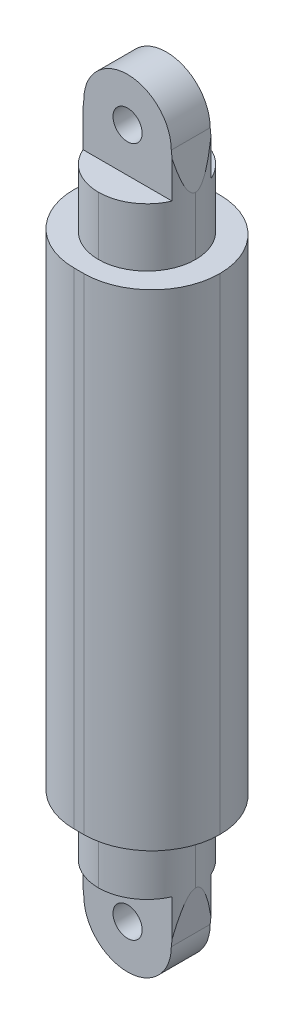
ISO-10303-21;
HEADER;
FILE_DESCRIPTION(('STEP AP214'),'2;1');
FILE_NAME('part.step','',(''),(''),'','','');
FILE_SCHEMA(('AUTOMOTIVE_DESIGN { 1 0 10303 214 1 1 1 1 }'));
ENDSEC;
DATA;
#1=APPLICATION_CONTEXT('core data for automotive mechanical design processes');
#2=APPLICATION_PROTOCOL_DEFINITION('international standard','automotive_design',2000,#1);
#3=PRODUCT_CONTEXT('',#1,'mechanical');
#4=PRODUCT('Part','Part','',(#3));
#5=PRODUCT_RELATED_PRODUCT_CATEGORY('part','',(#4));
#6=PRODUCT_DEFINITION_FORMATION('','',#4);
#7=PRODUCT_DEFINITION_CONTEXT('part definition',#1,'design');
#8=PRODUCT_DEFINITION('design','',#6,#7);
#9=PRODUCT_DEFINITION_SHAPE('','',#8);
#10=(LENGTH_UNIT() NAMED_UNIT(*) SI_UNIT(.MILLI.,.METRE.));
#11=(NAMED_UNIT(*) PLANE_ANGLE_UNIT() SI_UNIT($,.RADIAN.));
#12=(NAMED_UNIT(*) SI_UNIT($,.STERADIAN.) SOLID_ANGLE_UNIT());
#13=UNCERTAINTY_MEASURE_WITH_UNIT(LENGTH_MEASURE(1.E-05),#10,'distance_accuracy_value','');
#14=(GEOMETRIC_REPRESENTATION_CONTEXT(3) GLOBAL_UNCERTAINTY_ASSIGNED_CONTEXT((#13)) GLOBAL_UNIT_ASSIGNED_CONTEXT((#10,
#11,#12)) REPRESENTATION_CONTEXT('',''));
#15=CARTESIAN_POINT('',(0.,0.,0.));
#16=DIRECTION('',(0.,0.,1.));
#17=DIRECTION('',(1.,0.,0.));
#18=AXIS2_PLACEMENT_3D('',#15,#16,#17);
#19=CARTESIAN_POINT('',(0.,0.,5.));
#20=DIRECTION('',(0.,-1.,0.));
#21=DIRECTION('',(0.,0.,-1.));
#22=AXIS2_PLACEMENT_3D('',#19,#20,#21);
#23=CYLINDRICAL_SURFACE('',#22,5.);
#24=CARTESIAN_POINT('',(0.,-25.,5.));
#25=DIRECTION('',(0.,-1.,0.));
#26=DIRECTION('',(1.,0.,0.));
#27=AXIS2_PLACEMENT_3D('',#24,#25,#26);
#28=CIRCLE('',#27,5.);
#29=CARTESIAN_POINT('',(-5.,-25.,5.));
#30=VERTEX_POINT('',#29);
#31=CARTESIAN_POINT('',(0.,-25.,10.));
#32=VERTEX_POINT('',#31);
#33=EDGE_CURVE('E404',#30,#32,#28,.F.);
#34=ORIENTED_EDGE('',*,*,#33,.F.);
#35=DIRECTION('',(0.,-1.,0.));
#36=VECTOR('',#35,1.);
#37=CARTESIAN_POINT('',(-5.,-40.,5.));
#38=LINE('',#37,#36);
#39=CARTESIAN_POINT('',(-5.,-31.,5.));
#40=VERTEX_POINT('',#39);
#41=EDGE_CURVE('E497',#40,#30,#38,.F.);
#42=ORIENTED_EDGE('',*,*,#41,.F.);
#43=CARTESIAN_POINT('',(0.,-75.9999999999996,5.));
#44=DIRECTION('',(0.993883734673619,0.110431526074848,0.));
#45=DIRECTION('',(0.110431526074848,-0.993883734673619,0.));
#46=AXIS2_PLACEMENT_3D('',#43,#44,#45);
#47=ELLIPSE('',#46,45.2769256906867,5.);
#48=CARTESIAN_POINT('',(-4.58257569495584,-34.7568187453974,7.));
#49=VERTEX_POINT('',#48);
#50=EDGE_CURVE('E440',#49,#40,#47,.F.);
#51=ORIENTED_EDGE('',*,*,#50,.F.);
#52=DIRECTION('',(0.,-1.,0.));
#53=VECTOR('',#52,1.);
#54=CARTESIAN_POINT('',(-4.58257569495584,0.,7.));
#55=LINE('',#54,#53);
#56=CARTESIAN_POINT('',(-4.58257569495584,-31.,7.));
#57=VERTEX_POINT('',#56);
#58=EDGE_CURVE('E510',#57,#49,#55,.T.);
#59=ORIENTED_EDGE('',*,*,#58,.F.);
#60=CARTESIAN_POINT('',(0.,-31.,5.));
#61=DIRECTION('',(0.,-1.,0.));
#62=DIRECTION('',(0.,0.,-1.));
#63=AXIS2_PLACEMENT_3D('',#60,#61,#62);
#64=CIRCLE('',#63,5.);
#65=CARTESIAN_POINT('',(0.,-31.,10.));
#66=VERTEX_POINT('',#65);
#67=EDGE_CURVE('E513',#57,#66,#64,.F.);
#68=ORIENTED_EDGE('',*,*,#67,.T.);
#69=DIRECTION('',(0.,1.,0.));
#70=VECTOR('',#69,1.);
#71=CARTESIAN_POINT('',(0.,0.,10.));
#72=LINE('',#71,#70);
#73=EDGE_CURVE('E503',#66,#32,#72,.T.);
#74=ORIENTED_EDGE('',*,*,#73,.T.);
#75=EDGE_LOOP('',(#34,#42,#51,#59,#68,#74));
#76=FACE_BOUND('',#75,.T.);
#77=ADVANCED_FACE('F135',(#76),#23,.T.);
#78=CARTESIAN_POINT('',(0.,-40.,5.));
#79=DIRECTION('',(0.,1.,0.));
#80=DIRECTION('',(0.,0.,1.));
#81=AXIS2_PLACEMENT_3D('',#78,#79,#80);
#82=CYLINDRICAL_SURFACE('',#81,5.);
#83=CARTESIAN_POINT('',(0.,-25.,5.));
#84=DIRECTION('',(0.,-1.,0.));
#85=DIRECTION('',(1.,0.,0.));
#86=AXIS2_PLACEMENT_3D('',#83,#84,#85);
#87=CIRCLE('',#86,5.);
#88=CARTESIAN_POINT('',(0.,-25.,0.));
#89=VERTEX_POINT('',#88);
#90=EDGE_CURVE('E401',#89,#30,#87,.F.);
#91=ORIENTED_EDGE('',*,*,#90,.F.);
#92=DIRECTION('',(0.,1.,0.));
#93=VECTOR('',#92,1.);
#94=CARTESIAN_POINT('',(0.,-40.,0.));
#95=LINE('',#94,#93);
#96=CARTESIAN_POINT('',(0.,-31.,0.));
#97=VERTEX_POINT('',#96);
#98=EDGE_CURVE('E500',#89,#97,#95,.F.);
#99=ORIENTED_EDGE('',*,*,#98,.T.);
#100=CARTESIAN_POINT('',(0.,-31.,5.));
#101=DIRECTION('',(0.,-1.,0.));
#102=DIRECTION('',(0.,0.,-1.));
#103=AXIS2_PLACEMENT_3D('',#100,#101,#102);
#104=CIRCLE('',#103,5.);
#105=CARTESIAN_POINT('',(-4.58257569495584,-31.,3.));
#106=VERTEX_POINT('',#105);
#107=EDGE_CURVE('E507',#97,#106,#104,.F.);
#108=ORIENTED_EDGE('',*,*,#107,.T.);
#109=DIRECTION('',(0.,1.,0.));
#110=VECTOR('',#109,1.);
#111=CARTESIAN_POINT('',(-4.58257569495584,-40.,3.));
#112=LINE('',#111,#110);
#113=CARTESIAN_POINT('',(-4.58257569495584,-34.7568187453974,3.));
#114=VERTEX_POINT('',#113);
#115=EDGE_CURVE('E320',#114,#106,#112,.T.);
#116=ORIENTED_EDGE('',*,*,#115,.F.);
#117=CARTESIAN_POINT('',(0.,-75.9999999999996,5.));
#118=DIRECTION('',(0.993883734673619,0.110431526074848,0.));
#119=DIRECTION('',(-0.110431526074848,0.993883734673619,0.));
#120=AXIS2_PLACEMENT_3D('',#117,#118,#119);
#121=ELLIPSE('',#120,45.2769256906867,5.);
#122=EDGE_CURVE('E442',#40,#114,#121,.F.);
#123=ORIENTED_EDGE('',*,*,#122,.F.);
#124=ORIENTED_EDGE('',*,*,#41,.T.);
#125=EDGE_LOOP('',(#91,#99,#108,#116,#123,#124));
#126=FACE_BOUND('',#125,.T.);
#127=ADVANCED_FACE('F582',(#126),#82,.T.);
#128=CARTESIAN_POINT('',(0.,0.,5.));
#129=DIRECTION('',(0.,1.,0.));
#130=DIRECTION('',(-1.,0.,0.));
#131=AXIS2_PLACEMENT_3D('',#128,#129,#130);
#132=CYLINDRICAL_SURFACE('',#131,5.);
#133=CARTESIAN_POINT('',(0.,-25.,5.));
#134=DIRECTION('',(0.,-1.,0.));
#135=DIRECTION('',(1.,0.,0.));
#136=AXIS2_PLACEMENT_3D('',#133,#134,#135);
#137=CIRCLE('',#136,5.);
#138=CARTESIAN_POINT('',(5.,-25.,5.));
#139=VERTEX_POINT('',#138);
#140=EDGE_CURVE('E398',#32,#139,#137,.F.);
#141=ORIENTED_EDGE('',*,*,#140,.F.);
#142=ORIENTED_EDGE('',*,*,#73,.F.);
#143=CARTESIAN_POINT('',(0.,-31.,5.));
#144=DIRECTION('',(0.,-1.,0.));
#145=DIRECTION('',(0.,0.,-1.));
#146=AXIS2_PLACEMENT_3D('',#143,#144,#145);
#147=CIRCLE('',#146,5.);
#148=CARTESIAN_POINT('',(4.58257569495584,-31.,7.));
#149=VERTEX_POINT('',#148);
#150=EDGE_CURVE('E484',#66,#149,#147,.F.);
#151=ORIENTED_EDGE('',*,*,#150,.T.);
#152=DIRECTION('',(0.,1.,0.));
#153=VECTOR('',#152,1.);
#154=CARTESIAN_POINT('',(4.58257569495584,0.,7.));
#155=LINE('',#154,#153);
#156=CARTESIAN_POINT('',(4.58257569495584,-34.7568187453974,7.));
#157=VERTEX_POINT('',#156);
#158=EDGE_CURVE('E482',#157,#149,#155,.T.);
#159=ORIENTED_EDGE('',*,*,#158,.F.);
#160=CARTESIAN_POINT('',(0.,-76.,5.));
#161=DIRECTION('',(0.993883734673619,-0.110431526074847,0.));
#162=DIRECTION('',(0.110431526074847,0.993883734673619,0.));
#163=AXIS2_PLACEMENT_3D('',#160,#161,#162);
#164=ELLIPSE('',#163,45.2769256906871,5.);
#165=CARTESIAN_POINT('',(5.,-31.,5.));
#166=VERTEX_POINT('',#165);
#167=EDGE_CURVE('E450',#157,#166,#164,.F.);
#168=ORIENTED_EDGE('',*,*,#167,.T.);
#169=DIRECTION('',(0.,1.,0.));
#170=VECTOR('',#169,1.);
#171=CARTESIAN_POINT('',(5.,-40.,5.));
#172=LINE('',#171,#170);
#173=EDGE_CURVE('E321',#139,#166,#172,.F.);
#174=ORIENTED_EDGE('',*,*,#173,.F.);
#175=EDGE_LOOP('',(#141,#142,#151,#159,#168,#174));
#176=FACE_BOUND('',#175,.T.);
#177=ADVANCED_FACE('F589',(#176),#132,.T.);
#178=CARTESIAN_POINT('',(0.,-40.,5.));
#179=DIRECTION('',(0.,-1.,0.));
#180=DIRECTION('',(1.,0.,0.));
#181=AXIS2_PLACEMENT_3D('',#178,#179,#180);
#182=CYLINDRICAL_SURFACE('',#181,5.);
#183=CARTESIAN_POINT('',(0.,-25.,5.));
#184=DIRECTION('',(0.,-1.,0.));
#185=DIRECTION('',(1.,0.,0.));
#186=AXIS2_PLACEMENT_3D('',#183,#184,#185);
#187=CIRCLE('',#186,5.);
#188=EDGE_CURVE('E336',#139,#89,#187,.F.);
#189=ORIENTED_EDGE('',*,*,#188,.F.);
#190=ORIENTED_EDGE('',*,*,#173,.T.);
#191=CARTESIAN_POINT('',(0.,-76.,5.));
#192=DIRECTION('',(0.993883734673619,-0.110431526074847,0.));
#193=DIRECTION('',(-0.110431526074847,-0.993883734673619,0.));
#194=AXIS2_PLACEMENT_3D('',#191,#192,#193);
#195=ELLIPSE('',#194,45.2769256906871,5.);
#196=CARTESIAN_POINT('',(4.58257569495584,-34.7568187453974,3.));
#197=VERTEX_POINT('',#196);
#198=EDGE_CURVE('E453',#166,#197,#195,.F.);
#199=ORIENTED_EDGE('',*,*,#198,.T.);
#200=DIRECTION('',(0.,-1.,0.));
#201=VECTOR('',#200,1.);
#202=CARTESIAN_POINT('',(4.58257569495584,-40.,3.));
#203=LINE('',#202,#201);
#204=CARTESIAN_POINT('',(4.58257569495584,-31.,3.));
#205=VERTEX_POINT('',#204);
#206=EDGE_CURVE('E490',#205,#197,#203,.T.);
#207=ORIENTED_EDGE('',*,*,#206,.F.);
#208=CARTESIAN_POINT('',(0.,-31.,5.));
#209=DIRECTION('',(0.,-1.,0.));
#210=DIRECTION('',(0.,0.,-1.));
#211=AXIS2_PLACEMENT_3D('',#208,#209,#210);
#212=CIRCLE('',#211,5.);
#213=EDGE_CURVE('E493',#205,#97,#212,.F.);
#214=ORIENTED_EDGE('',*,*,#213,.T.);
#215=ORIENTED_EDGE('',*,*,#98,.F.);
#216=EDGE_LOOP('',(#189,#190,#199,#207,#214,#215));
#217=FACE_BOUND('',#216,.T.);
#218=ADVANCED_FACE('F576',(#217),#182,.T.);
#219=CARTESIAN_POINT('',(0.,-31.,3.));
#220=DIRECTION('',(0.,-1.,0.));
#221=DIRECTION('',(0.,0.,-1.));
#222=AXIS2_PLACEMENT_3D('',#219,#220,#221);
#223=PLANE('',#222);
#224=DIRECTION('',(-1.,0.,0.));
#225=VECTOR('',#224,1.);
#226=CARTESIAN_POINT('',(0.,-31.,3.));
#227=LINE('',#226,#225);
#228=EDGE_CURVE('E487',#205,#106,#227,.T.);
#229=ORIENTED_EDGE('',*,*,#228,.T.);
#230=ORIENTED_EDGE('',*,*,#107,.F.);
#231=ORIENTED_EDGE('',*,*,#213,.F.);
#232=EDGE_LOOP('',(#229,#230,#231));
#233=FACE_BOUND('',#232,.T.);
#234=ADVANCED_FACE('F607',(#233),#223,.T.);
#235=CARTESIAN_POINT('',(0.,0.,3.));
#236=DIRECTION('',(0.,0.,1.));
#237=DIRECTION('',(1.,0.,0.));
#238=AXIS2_PLACEMENT_3D('',#235,#236,#237);
#239=PLANE('',#238);
#240=CARTESIAN_POINT('',(0.,-35.5,3.));
#241=DIRECTION('',(0.,0.,-1.));
#242=DIRECTION('',(-1.,0.,0.));
#243=AXIS2_PLACEMENT_3D('',#240,#241,#242);
#244=CIRCLE('',#243,1.5);
#245=CARTESIAN_POINT('',(-1.50000000000001,-35.5,3.));
#246=VERTEX_POINT('',#245);
#247=EDGE_CURVE('E433',#246,#246,#244,.T.);
#248=ORIENTED_EDGE('',*,*,#247,.F.);
#249=EDGE_LOOP('',(#248));
#250=FACE_BOUND('',#249,.T.);
#251=CARTESIAN_POINT('',(0.,-35.5,3.));
#252=DIRECTION('',(0.,0.,1.));
#253=DIRECTION('',(1.,0.,0.));
#254=AXIS2_PLACEMENT_3D('',#251,#252,#253);
#255=CIRCLE('',#254,4.5);
#256=CARTESIAN_POINT('',(4.5,-35.5,3.));
#257=VERTEX_POINT('',#256);
#258=CARTESIAN_POINT('',(-4.5,-35.5,3.));
#259=VERTEX_POINT('',#258);
#260=EDGE_CURVE('E458',#257,#259,#255,.F.);
#261=ORIENTED_EDGE('',*,*,#260,.T.);
#262=DIRECTION('',(-0.110431526074848,0.993883734673619,0.));
#263=VECTOR('',#262,1.);
#264=CARTESIAN_POINT('',(-8.34146341463418,-0.926829268292695,3.));
#265=LINE('',#264,#263);
#266=EDGE_CURVE('E444',#259,#114,#265,.T.);
#267=ORIENTED_EDGE('',*,*,#266,.T.);
#268=ORIENTED_EDGE('',*,*,#115,.T.);
#269=ORIENTED_EDGE('',*,*,#228,.F.);
#270=ORIENTED_EDGE('',*,*,#206,.T.);
#271=DIRECTION('',(0.110431526074847,0.993883734673619,0.));
#272=VECTOR('',#271,1.);
#273=CARTESIAN_POINT('',(8.34146341463414,-0.926829268292683,3.));
#274=LINE('',#273,#272);
#275=EDGE_CURVE('E456',#257,#197,#274,.T.);
#276=ORIENTED_EDGE('',*,*,#275,.F.);
#277=EDGE_LOOP('',(#261,#267,#268,#269,#270,#276));
#278=FACE_BOUND('',#277,.T.);
#279=ADVANCED_FACE('F610',(#250,#278),#239,.F.);
#280=CARTESIAN_POINT('',(5.,-31.,10.));
#281=DIRECTION('',(0.,-1.,0.));
#282=DIRECTION('',(0.,0.,-1.));
#283=AXIS2_PLACEMENT_3D('',#280,#281,#282);
#284=PLANE('',#283);
#285=ORIENTED_EDGE('',*,*,#67,.F.);
#286=DIRECTION('',(-1.,0.,0.));
#287=VECTOR('',#286,1.);
#288=CARTESIAN_POINT('',(5.,-31.,7.));
#289=LINE('',#288,#287);
#290=EDGE_CURVE('E480',#149,#57,#289,.T.);
#291=ORIENTED_EDGE('',*,*,#290,.F.);
#292=ORIENTED_EDGE('',*,*,#150,.F.);
#293=EDGE_LOOP('',(#285,#291,#292));
#294=FACE_BOUND('',#293,.T.);
#295=ADVANCED_FACE('F614',(#294),#284,.T.);
#296=CARTESIAN_POINT('',(0.,0.,7.));
#297=DIRECTION('',(0.,0.,-1.));
#298=DIRECTION('',(-1.,0.,0.));
#299=AXIS2_PLACEMENT_3D('',#296,#297,#298);
#300=PLANE('',#299);
#301=CARTESIAN_POINT('',(0.,-35.5,7.));
#302=DIRECTION('',(0.,0.,-1.));
#303=DIRECTION('',(-1.,0.,0.));
#304=AXIS2_PLACEMENT_3D('',#301,#302,#303);
#305=CIRCLE('',#304,1.5);
#306=CARTESIAN_POINT('',(-1.50000000000001,-35.5,7.));
#307=VERTEX_POINT('',#306);
#308=EDGE_CURVE('E436',#307,#307,#305,.T.);
#309=ORIENTED_EDGE('',*,*,#308,.T.);
#310=EDGE_LOOP('',(#309));
#311=FACE_BOUND('',#310,.T.);
#312=DIRECTION('',(0.110431526074848,-0.993883734673619,0.));
#313=VECTOR('',#312,1.);
#314=CARTESIAN_POINT('',(-8.34146341463418,-0.926829268292695,7.));
#315=LINE('',#314,#313);
#316=CARTESIAN_POINT('',(-4.5,-35.5,7.));
#317=VERTEX_POINT('',#316);
#318=EDGE_CURVE('E526',#49,#317,#315,.T.);
#319=ORIENTED_EDGE('',*,*,#318,.T.);
#320=CARTESIAN_POINT('',(0.,-35.5,7.));
#321=DIRECTION('',(0.,0.,-1.));
#322=DIRECTION('',(-1.,0.,0.));
#323=AXIS2_PLACEMENT_3D('',#320,#321,#322);
#324=CIRCLE('',#323,4.5);
#325=CARTESIAN_POINT('',(4.5,-35.5,7.));
#326=VERTEX_POINT('',#325);
#327=EDGE_CURVE('E523',#317,#326,#324,.F.);
#328=ORIENTED_EDGE('',*,*,#327,.T.);
#329=DIRECTION('',(-0.110431526074847,-0.993883734673619,0.));
#330=VECTOR('',#329,1.);
#331=CARTESIAN_POINT('',(8.34146341463414,-0.926829268292683,7.));
#332=LINE('',#331,#330);
#333=EDGE_CURVE('E521',#157,#326,#332,.T.);
#334=ORIENTED_EDGE('',*,*,#333,.F.);
#335=ORIENTED_EDGE('',*,*,#158,.T.);
#336=ORIENTED_EDGE('',*,*,#290,.T.);
#337=ORIENTED_EDGE('',*,*,#58,.T.);
#338=EDGE_LOOP('',(#319,#328,#334,#335,#336,#337));
#339=FACE_BOUND('',#338,.T.);
#340=ADVANCED_FACE('F616',(#311,#339),#300,.F.);
#341=CARTESIAN_POINT('',(0.,-35.5,10.));
#342=DIRECTION('',(0.,0.,-1.));
#343=DIRECTION('',(-1.,0.,0.));
#344=AXIS2_PLACEMENT_3D('',#341,#342,#343);
#345=CYLINDRICAL_SURFACE('',#344,4.5);
#346=DIRECTION('',(0.,0.,-1.));
#347=VECTOR('',#346,1.);
#348=CARTESIAN_POINT('',(4.5,-35.5,10.));
#349=LINE('',#348,#347);
#350=EDGE_CURVE('E447',#326,#257,#349,.T.);
#351=ORIENTED_EDGE('',*,*,#350,.F.);
#352=ORIENTED_EDGE('',*,*,#327,.F.);
#353=DIRECTION('',(0.,0.,-1.));
#354=VECTOR('',#353,1.);
#355=CARTESIAN_POINT('',(-4.5,-35.5,10.));
#356=LINE('',#355,#354);
#357=EDGE_CURVE('E437',#317,#259,#356,.T.);
#358=ORIENTED_EDGE('',*,*,#357,.T.);
#359=ORIENTED_EDGE('',*,*,#260,.F.);
#360=EDGE_LOOP('',(#351,#352,#358,#359));
#361=FACE_BOUND('',#360,.T.);
#362=ADVANCED_FACE('F619',(#361),#345,.T.);
#363=CARTESIAN_POINT('',(8.34146341463414,-0.926829268292683,10.));
#364=DIRECTION('',(0.993883734673619,-0.110431526074847,0.));
#365=DIRECTION('',(0.110431526074847,0.993883734673619,0.));
#366=AXIS2_PLACEMENT_3D('',#363,#364,#365);
#367=PLANE('',#366);
#368=ORIENTED_EDGE('',*,*,#275,.T.);
#369=ORIENTED_EDGE('',*,*,#198,.F.);
#370=ORIENTED_EDGE('',*,*,#167,.F.);
#371=ORIENTED_EDGE('',*,*,#333,.T.);
#372=ORIENTED_EDGE('',*,*,#350,.T.);
#373=EDGE_LOOP('',(#368,#369,#370,#371,#372));
#374=FACE_BOUND('',#373,.T.);
#375=ADVANCED_FACE('F625',(#374),#367,.T.);
#376=CARTESIAN_POINT('',(-8.34146341463418,-0.926829268292695,10.));
#377=DIRECTION('',(0.993883734673619,0.110431526074848,0.));
#378=DIRECTION('',(-0.110431526074848,0.993883734673619,0.));
#379=AXIS2_PLACEMENT_3D('',#376,#377,#378);
#380=PLANE('',#379);
#381=ORIENTED_EDGE('',*,*,#357,.F.);
#382=ORIENTED_EDGE('',*,*,#318,.F.);
#383=ORIENTED_EDGE('',*,*,#50,.T.);
#384=ORIENTED_EDGE('',*,*,#122,.T.);
#385=ORIENTED_EDGE('',*,*,#266,.F.);
#386=EDGE_LOOP('',(#381,#382,#383,#384,#385));
#387=FACE_BOUND('',#386,.T.);
#388=ADVANCED_FACE('F635',(#387),#380,.F.);
#389=CARTESIAN_POINT('',(0.,-35.5,10.));
#390=DIRECTION('',(0.,0.,-1.));
#391=DIRECTION('',(-1.,0.,0.));
#392=AXIS2_PLACEMENT_3D('',#389,#390,#391);
#393=CYLINDRICAL_SURFACE('',#392,1.5);
#394=ORIENTED_EDGE('',*,*,#247,.T.);
#395=EDGE_LOOP('',(#394));
#396=FACE_BOUND('',#395,.T.);
#397=ORIENTED_EDGE('',*,*,#308,.F.);
#398=EDGE_LOOP('',(#397));
#399=FACE_BOUND('',#398,.T.);
#400=ADVANCED_FACE('F662',(#396,#399),#393,.F.);
#401=CARTESIAN_POINT('',(-7.5,-25.,-2.));
#402=DIRECTION('',(0.,-1.,0.));
#403=DIRECTION('',(1.,0.,0.));
#404=AXIS2_PLACEMENT_3D('',#401,#402,#403);
#405=PLANE('',#404);
#406=ORIENTED_EDGE('',*,*,#90,.T.);
#407=ORIENTED_EDGE('',*,*,#33,.T.);
#408=ORIENTED_EDGE('',*,*,#140,.T.);
#409=ORIENTED_EDGE('',*,*,#188,.T.);
#410=EDGE_LOOP('',(#406,#407,#408,#409));
#411=FACE_BOUND('',#410,.T.);
#412=CARTESIAN_POINT('',(0.500000000000015,-25.,5.));
#413=DIRECTION('',(0.,-1.,0.));
#414=DIRECTION('',(1.,0.,0.));
#415=AXIS2_PLACEMENT_3D('',#412,#413,#414);
#416=CIRCLE('',#415,7.);
#417=CARTESIAN_POINT('',(0.500000000000013,-25.,-2.));
#418=VERTEX_POINT('',#417);
#419=CARTESIAN_POINT('',(7.50000000000002,-25.,5.));
#420=VERTEX_POINT('',#419);
#421=EDGE_CURVE('E356',#418,#420,#416,.T.);
#422=ORIENTED_EDGE('',*,*,#421,.T.);
#423=CARTESIAN_POINT('',(0.500000000000015,-25.,5.));
#424=DIRECTION('',(0.,-1.,0.));
#425=DIRECTION('',(1.,0.,0.));
#426=AXIS2_PLACEMENT_3D('',#423,#424,#425);
#427=CIRCLE('',#426,7.);
#428=CARTESIAN_POINT('',(0.500000000000013,-25.,12.));
#429=VERTEX_POINT('',#428);
#430=EDGE_CURVE('E358',#420,#429,#427,.T.);
#431=ORIENTED_EDGE('',*,*,#430,.T.);
#432=DIRECTION('',(1.,0.,0.));
#433=VECTOR('',#432,1.);
#434=CARTESIAN_POINT('',(-7.5,-25.,12.));
#435=LINE('',#434,#433);
#436=CARTESIAN_POINT('',(-0.500000000000003,-25.,12.));
#437=VERTEX_POINT('',#436);
#438=EDGE_CURVE('E374',#437,#429,#435,.T.);
#439=ORIENTED_EDGE('',*,*,#438,.F.);
#440=CARTESIAN_POINT('',(-0.500000000000001,-25.,5.));
#441=DIRECTION('',(0.,-1.,0.));
#442=DIRECTION('',(1.,0.,0.));
#443=AXIS2_PLACEMENT_3D('',#440,#441,#442);
#444=CIRCLE('',#443,7.);
#445=CARTESIAN_POINT('',(-7.5,-25.,5.));
#446=VERTEX_POINT('',#445);
#447=EDGE_CURVE('E354',#437,#446,#444,.T.);
#448=ORIENTED_EDGE('',*,*,#447,.T.);
#449=CARTESIAN_POINT('',(-0.500000000000001,-25.,5.));
#450=DIRECTION('',(0.,-1.,0.));
#451=DIRECTION('',(1.,0.,0.));
#452=AXIS2_PLACEMENT_3D('',#449,#450,#451);
#453=CIRCLE('',#452,7.);
#454=CARTESIAN_POINT('',(-0.500000000000003,-25.,-2.));
#455=VERTEX_POINT('',#454);
#456=EDGE_CURVE('E352',#446,#455,#453,.T.);
#457=ORIENTED_EDGE('',*,*,#456,.T.);
#458=DIRECTION('',(1.,0.,0.));
#459=VECTOR('',#458,1.);
#460=CARTESIAN_POINT('',(-7.5,-25.,-2.));
#461=LINE('',#460,#459);
#462=EDGE_CURVE('E332',#455,#418,#461,.T.);
#463=ORIENTED_EDGE('',*,*,#462,.T.);
#464=EDGE_LOOP('',(#422,#431,#439,#448,#457,#463));
#465=FACE_BOUND('',#464,.T.);
#466=ADVANCED_FACE('F389',(#411,#465),#405,.T.);
#467=CARTESIAN_POINT('',(-7.50000000000001,25.,-2.));
#468=DIRECTION('',(0.,1.,0.));
#469=DIRECTION('',(0.,0.,1.));
#470=AXIS2_PLACEMENT_3D('',#467,#468,#469);
#471=PLANE('',#470);
#472=CARTESIAN_POINT('',(0.,25.,5.));
#473=DIRECTION('',(0.,1.,0.));
#474=DIRECTION('',(0.,0.,1.));
#475=AXIS2_PLACEMENT_3D('',#472,#473,#474);
#476=CIRCLE('',#475,5.);
#477=CARTESIAN_POINT('',(5.,25.,5.));
#478=VERTEX_POINT('',#477);
#479=CARTESIAN_POINT('',(0.,25.,10.));
#480=VERTEX_POINT('',#479);
#481=EDGE_CURVE('E325',#478,#480,#476,.F.);
#482=ORIENTED_EDGE('',*,*,#481,.T.);
#483=CARTESIAN_POINT('',(0.,25.,5.));
#484=DIRECTION('',(0.,1.,0.));
#485=DIRECTION('',(0.,0.,1.));
#486=AXIS2_PLACEMENT_3D('',#483,#484,#485);
#487=CIRCLE('',#486,5.);
#488=CARTESIAN_POINT('',(-5.,25.,5.));
#489=VERTEX_POINT('',#488);
#490=EDGE_CURVE('E396',#480,#489,#487,.F.);
#491=ORIENTED_EDGE('',*,*,#490,.T.);
#492=CARTESIAN_POINT('',(0.,25.,5.));
#493=DIRECTION('',(0.,1.,0.));
#494=DIRECTION('',(0.,0.,1.));
#495=AXIS2_PLACEMENT_3D('',#492,#493,#494);
#496=CIRCLE('',#495,5.);
#497=CARTESIAN_POINT('',(0.,25.,0.));
#498=VERTEX_POINT('',#497);
#499=EDGE_CURVE('E331',#489,#498,#496,.F.);
#500=ORIENTED_EDGE('',*,*,#499,.T.);
#501=CARTESIAN_POINT('',(0.,25.,5.));
#502=DIRECTION('',(0.,1.,0.));
#503=DIRECTION('',(0.,0.,1.));
#504=AXIS2_PLACEMENT_3D('',#501,#502,#503);
#505=CIRCLE('',#504,5.);
#506=EDGE_CURVE('E314',#498,#478,#505,.F.);
#507=ORIENTED_EDGE('',*,*,#506,.T.);
#508=EDGE_LOOP('',(#482,#491,#500,#507));
#509=FACE_BOUND('',#508,.T.);
#510=DIRECTION('',(-1.,0.,0.));
#511=VECTOR('',#510,1.);
#512=CARTESIAN_POINT('',(-7.50000000000001,25.,12.));
#513=LINE('',#512,#511);
#514=CARTESIAN_POINT('',(0.499999999999994,25.,12.));
#515=VERTEX_POINT('',#514);
#516=CARTESIAN_POINT('',(-0.500000000000007,25.,12.));
#517=VERTEX_POINT('',#516);
#518=EDGE_CURVE('E369',#515,#517,#513,.T.);
#519=ORIENTED_EDGE('',*,*,#518,.F.);
#520=CARTESIAN_POINT('',(0.499999999999993,25.,5.));
#521=DIRECTION('',(0.,1.,0.));
#522=DIRECTION('',(0.,0.,1.));
#523=AXIS2_PLACEMENT_3D('',#520,#521,#522);
#524=CIRCLE('',#523,7.);
#525=CARTESIAN_POINT('',(7.49999999999999,25.,5.));
#526=VERTEX_POINT('',#525);
#527=EDGE_CURVE('E365',#515,#526,#524,.T.);
#528=ORIENTED_EDGE('',*,*,#527,.T.);
#529=CARTESIAN_POINT('',(0.499999999999993,25.,5.));
#530=DIRECTION('',(0.,1.,0.));
#531=DIRECTION('',(0.,0.,1.));
#532=AXIS2_PLACEMENT_3D('',#529,#530,#531);
#533=CIRCLE('',#532,7.);
#534=CARTESIAN_POINT('',(0.499999999999994,25.,-2.));
#535=VERTEX_POINT('',#534);
#536=EDGE_CURVE('E158',#526,#535,#533,.T.);
#537=ORIENTED_EDGE('',*,*,#536,.T.);
#538=DIRECTION('',(-1.,0.,0.));
#539=VECTOR('',#538,1.);
#540=CARTESIAN_POINT('',(-7.50000000000001,25.,-2.));
#541=LINE('',#540,#539);
#542=CARTESIAN_POINT('',(-0.500000000000007,25.,-2.));
#543=VERTEX_POINT('',#542);
#544=EDGE_CURVE('E387',#535,#543,#541,.T.);
#545=ORIENTED_EDGE('',*,*,#544,.T.);
#546=CARTESIAN_POINT('',(-0.500000000000007,25.,5.));
#547=DIRECTION('',(0.,1.,0.));
#548=DIRECTION('',(0.,0.,1.));
#549=AXIS2_PLACEMENT_3D('',#546,#547,#548);
#550=CIRCLE('',#549,7.);
#551=CARTESIAN_POINT('',(-7.50000000000001,25.,5.));
#552=VERTEX_POINT('',#551);
#553=EDGE_CURVE('E360',#543,#552,#550,.T.);
#554=ORIENTED_EDGE('',*,*,#553,.T.);
#555=CARTESIAN_POINT('',(-0.500000000000007,25.,5.));
#556=DIRECTION('',(0.,1.,0.));
#557=DIRECTION('',(0.,0.,1.));
#558=AXIS2_PLACEMENT_3D('',#555,#556,#557);
#559=CIRCLE('',#558,7.);
#560=EDGE_CURVE('E362',#552,#517,#559,.T.);
#561=ORIENTED_EDGE('',*,*,#560,.T.);
#562=EDGE_LOOP('',(#519,#528,#537,#545,#554,#561));
#563=FACE_BOUND('',#562,.T.);
#564=ADVANCED_FACE('F335',(#509,#563),#471,.T.);
#565=CARTESIAN_POINT('',(0.,0.,-2.));
#566=DIRECTION('',(0.,0.,-1.));
#567=DIRECTION('',(-1.,0.,0.));
#568=AXIS2_PLACEMENT_3D('',#565,#566,#567);
#569=PLANE('',#568);
#570=ORIENTED_EDGE('',*,*,#544,.F.);
#571=DIRECTION('',(0.,1.,0.));
#572=VECTOR('',#571,1.);
#573=CARTESIAN_POINT('',(0.500000000000004,0.,-2.));
#574=LINE('',#573,#572);
#575=EDGE_CURVE('E12',#535,#418,#574,.F.);
#576=ORIENTED_EDGE('',*,*,#575,.T.);
#577=ORIENTED_EDGE('',*,*,#462,.F.);
#578=DIRECTION('',(0.,-1.,0.));
#579=VECTOR('',#578,1.);
#580=CARTESIAN_POINT('',(-0.500000000000004,0.,-2.));
#581=LINE('',#580,#579);
#582=EDGE_CURVE('E144',#455,#543,#581,.F.);
#583=ORIENTED_EDGE('',*,*,#582,.T.);
#584=EDGE_LOOP('',(#570,#576,#577,#583));
#585=FACE_BOUND('',#584,.T.);
#586=ADVANCED_FACE('F386',(#585),#569,.T.);
#587=CARTESIAN_POINT('',(0.,0.,12.));
#588=DIRECTION('',(0.,0.,-1.));
#589=DIRECTION('',(-1.,0.,0.));
#590=AXIS2_PLACEMENT_3D('',#587,#588,#589);
#591=PLANE('',#590);
#592=ORIENTED_EDGE('',*,*,#518,.T.);
#593=DIRECTION('',(0.,-1.,0.));
#594=VECTOR('',#593,1.);
#595=CARTESIAN_POINT('',(-0.500000000000001,-25.,12.));
#596=LINE('',#595,#594);
#597=EDGE_CURVE('E349',#517,#437,#596,.T.);
#598=ORIENTED_EDGE('',*,*,#597,.T.);
#599=ORIENTED_EDGE('',*,*,#438,.T.);
#600=DIRECTION('',(0.,1.,0.));
#601=VECTOR('',#600,1.);
#602=CARTESIAN_POINT('',(0.499999999999993,25.,12.));
#603=LINE('',#602,#601);
#604=EDGE_CURVE('E340',#429,#515,#603,.T.);
#605=ORIENTED_EDGE('',*,*,#604,.T.);
#606=EDGE_LOOP('',(#592,#598,#599,#605));
#607=FACE_BOUND('',#606,.T.);
#608=ADVANCED_FACE('F684',(#607),#591,.F.);
#609=CARTESIAN_POINT('',(0.,35.5,10.));
#610=DIRECTION('',(0.,0.,-1.));
#611=DIRECTION('',(-1.,0.,0.));
#612=AXIS2_PLACEMENT_3D('',#609,#610,#611);
#613=CYLINDRICAL_SURFACE('',#612,4.5);
#614=CARTESIAN_POINT('',(0.,35.5,3.));
#615=DIRECTION('',(0.,0.,1.));
#616=DIRECTION('',(1.,0.,0.));
#617=AXIS2_PLACEMENT_3D('',#614,#615,#616);
#618=CIRCLE('',#617,4.5);
#619=CARTESIAN_POINT('',(4.5,35.5,3.));
#620=VERTEX_POINT('',#619);
#621=CARTESIAN_POINT('',(-4.5,35.5,3.));
#622=VERTEX_POINT('',#621);
#623=EDGE_CURVE('E427',#620,#622,#618,.T.);
#624=ORIENTED_EDGE('',*,*,#623,.T.);
#625=DIRECTION('',(0.,0.,-1.));
#626=VECTOR('',#625,1.);
#627=CARTESIAN_POINT('',(-4.5,35.5,10.));
#628=LINE('',#627,#626);
#629=CARTESIAN_POINT('',(-4.5,35.5,7.));
#630=VERTEX_POINT('',#629);
#631=EDGE_CURVE('E407',#630,#622,#628,.T.);
#632=ORIENTED_EDGE('',*,*,#631,.F.);
#633=CARTESIAN_POINT('',(0.,35.5,7.));
#634=DIRECTION('',(0.,0.,-1.));
#635=DIRECTION('',(-1.,0.,0.));
#636=AXIS2_PLACEMENT_3D('',#633,#634,#635);
#637=CIRCLE('',#636,4.5);
#638=CARTESIAN_POINT('',(4.5,35.5,7.));
#639=VERTEX_POINT('',#638);
#640=EDGE_CURVE('E343',#630,#639,#637,.T.);
#641=ORIENTED_EDGE('',*,*,#640,.T.);
#642=DIRECTION('',(0.,0.,-1.));
#643=VECTOR('',#642,1.);
#644=CARTESIAN_POINT('',(4.5,35.5,10.));
#645=LINE('',#644,#643);
#646=EDGE_CURVE('E418',#639,#620,#645,.T.);
#647=ORIENTED_EDGE('',*,*,#646,.T.);
#648=EDGE_LOOP('',(#624,#632,#641,#647));
#649=FACE_BOUND('',#648,.T.);
#650=ADVANCED_FACE('F538',(#649),#613,.T.);
#651=CARTESIAN_POINT('',(0.,35.5,10.));
#652=DIRECTION('',(0.,0.,-1.));
#653=DIRECTION('',(-1.,0.,0.));
#654=AXIS2_PLACEMENT_3D('',#651,#652,#653);
#655=CYLINDRICAL_SURFACE('',#654,1.5);
#656=CARTESIAN_POINT('',(0.,35.5,3.));
#657=DIRECTION('',(0.,0.,1.));
#658=DIRECTION('',(-1.,0.,0.));
#659=AXIS2_PLACEMENT_3D('',#656,#657,#658);
#660=CIRCLE('',#659,1.5);
#661=CARTESIAN_POINT('',(-1.50000000000001,35.5,3.));
#662=VERTEX_POINT('',#661);
#663=EDGE_CURVE('E429',#662,#662,#660,.T.);
#664=ORIENTED_EDGE('',*,*,#663,.F.);
#665=EDGE_LOOP('',(#664));
#666=FACE_BOUND('',#665,.T.);
#667=CARTESIAN_POINT('',(0.,35.5,7.));
#668=DIRECTION('',(0.,0.,-1.));
#669=DIRECTION('',(-1.,0.,0.));
#670=AXIS2_PLACEMENT_3D('',#667,#668,#669);
#671=CIRCLE('',#670,1.5);
#672=CARTESIAN_POINT('',(-1.50000000000001,35.5,7.));
#673=VERTEX_POINT('',#672);
#674=EDGE_CURVE('E432',#673,#673,#671,.F.);
#675=ORIENTED_EDGE('',*,*,#674,.T.);
#676=EDGE_LOOP('',(#675));
#677=FACE_BOUND('',#676,.T.);
#678=ADVANCED_FACE('F671',(#666,#677),#655,.F.);
#679=CARTESIAN_POINT('',(-8.34146341463418,0.926829268292695,10.));
#680=DIRECTION('',(-0.993883734673619,0.110431526074848,0.));
#681=DIRECTION('',(-0.110431526074848,-0.993883734673619,0.));
#682=AXIS2_PLACEMENT_3D('',#679,#680,#681);
#683=PLANE('',#682);
#684=DIRECTION('',(-0.110431526074848,-0.993883734673619,0.));
#685=VECTOR('',#684,1.);
#686=CARTESIAN_POINT('',(-8.34146341463418,0.926829268292695,3.));
#687=LINE('',#686,#685);
#688=CARTESIAN_POINT('',(-4.58257569495584,34.7568187453974,3.));
#689=VERTEX_POINT('',#688);
#690=EDGE_CURVE('E416',#622,#689,#687,.T.);
#691=ORIENTED_EDGE('',*,*,#690,.T.);
#692=CARTESIAN_POINT('',(0.,75.9999999999996,5.));
#693=DIRECTION('',(-0.993883734673619,0.110431526074848,0.));
#694=DIRECTION('',(0.110431526074848,0.993883734673619,0.));
#695=AXIS2_PLACEMENT_3D('',#692,#693,#694);
#696=ELLIPSE('',#695,45.2769256906867,5.);
#697=CARTESIAN_POINT('',(-5.,31.,5.));
#698=VERTEX_POINT('',#697);
#699=EDGE_CURVE('E337',#698,#689,#696,.F.);
#700=ORIENTED_EDGE('',*,*,#699,.F.);
#701=CARTESIAN_POINT('',(0.,75.9999999999996,5.));
#702=DIRECTION('',(-0.993883734673619,0.110431526074848,0.));
#703=DIRECTION('',(-0.110431526074848,-0.993883734673619,0.));
#704=AXIS2_PLACEMENT_3D('',#701,#702,#703);
#705=ELLIPSE('',#704,45.2769256906867,5.);
#706=CARTESIAN_POINT('',(-4.58257569495584,34.7568187453974,7.));
#707=VERTEX_POINT('',#706);
#708=EDGE_CURVE('E410',#707,#698,#705,.F.);
#709=ORIENTED_EDGE('',*,*,#708,.F.);
#710=DIRECTION('',(0.110431526074848,0.993883734673619,0.));
#711=VECTOR('',#710,1.);
#712=CARTESIAN_POINT('',(-8.34146341463418,0.926829268292695,7.));
#713=LINE('',#712,#711);
#714=EDGE_CURVE('E413',#707,#630,#713,.T.);
#715=ORIENTED_EDGE('',*,*,#714,.T.);
#716=ORIENTED_EDGE('',*,*,#631,.T.);
#717=EDGE_LOOP('',(#691,#700,#709,#715,#716));
#718=FACE_BOUND('',#717,.T.);
#719=ADVANCED_FACE('F559',(#718),#683,.T.);
#720=CARTESIAN_POINT('',(5.,31.,10.));
#721=DIRECTION('',(0.,-1.,0.));
#722=DIRECTION('',(0.,0.,-1.));
#723=AXIS2_PLACEMENT_3D('',#720,#721,#722);
#724=PLANE('',#723);
#725=CARTESIAN_POINT('',(0.,31.,5.));
#726=DIRECTION('',(0.,-1.,0.));
#727=DIRECTION('',(0.,0.,-1.));
#728=AXIS2_PLACEMENT_3D('',#725,#726,#727);
#729=CIRCLE('',#728,5.);
#730=CARTESIAN_POINT('',(0.,31.,10.));
#731=VERTEX_POINT('',#730);
#732=CARTESIAN_POINT('',(4.58257569495584,31.,7.));
#733=VERTEX_POINT('',#732);
#734=EDGE_CURVE('E468',#731,#733,#729,.F.);
#735=ORIENTED_EDGE('',*,*,#734,.T.);
#736=DIRECTION('',(-1.,0.,0.));
#737=VECTOR('',#736,1.);
#738=CARTESIAN_POINT('',(5.,31.,7.));
#739=LINE('',#738,#737);
#740=CARTESIAN_POINT('',(-4.58257569495584,31.,7.));
#741=VERTEX_POINT('',#740);
#742=EDGE_CURVE('E460',#733,#741,#739,.T.);
#743=ORIENTED_EDGE('',*,*,#742,.T.);
#744=CARTESIAN_POINT('',(0.,31.,5.));
#745=DIRECTION('',(0.,-1.,0.));
#746=DIRECTION('',(0.,0.,-1.));
#747=AXIS2_PLACEMENT_3D('',#744,#745,#746);
#748=CIRCLE('',#747,5.);
#749=EDGE_CURVE('E518',#741,#731,#748,.F.);
#750=ORIENTED_EDGE('',*,*,#749,.T.);
#751=EDGE_LOOP('',(#735,#743,#750));
#752=FACE_BOUND('',#751,.T.);
#753=ADVANCED_FACE('F548',(#752),#724,.F.);
#754=CARTESIAN_POINT('',(0.,0.,7.));
#755=DIRECTION('',(0.,0.,-1.));
#756=DIRECTION('',(-1.,0.,0.));
#757=AXIS2_PLACEMENT_3D('',#754,#755,#756);
#758=PLANE('',#757);
#759=ORIENTED_EDGE('',*,*,#674,.F.);
#760=EDGE_LOOP('',(#759));
#761=FACE_BOUND('',#760,.T.);
#762=ORIENTED_EDGE('',*,*,#640,.F.);
#763=ORIENTED_EDGE('',*,*,#714,.F.);
#764=DIRECTION('',(0.,-1.,0.));
#765=VECTOR('',#764,1.);
#766=CARTESIAN_POINT('',(-4.58257569495584,0.,7.));
#767=LINE('',#766,#765);
#768=EDGE_CURVE('E463',#707,#741,#767,.T.);
#769=ORIENTED_EDGE('',*,*,#768,.T.);
#770=ORIENTED_EDGE('',*,*,#742,.F.);
#771=DIRECTION('',(0.,1.,0.));
#772=VECTOR('',#771,1.);
#773=CARTESIAN_POINT('',(4.58257569495584,0.,7.));
#774=LINE('',#773,#772);
#775=CARTESIAN_POINT('',(4.58257569495584,34.7568187453975,7.));
#776=VERTEX_POINT('',#775);
#777=EDGE_CURVE('E465',#733,#776,#774,.T.);
#778=ORIENTED_EDGE('',*,*,#777,.T.);
#779=DIRECTION('',(-0.110431526074847,0.993883734673619,0.));
#780=VECTOR('',#779,1.);
#781=CARTESIAN_POINT('',(8.34146341463414,0.926829268292683,7.));
#782=LINE('',#781,#780);
#783=EDGE_CURVE('E529',#776,#639,#782,.T.);
#784=ORIENTED_EDGE('',*,*,#783,.T.);
#785=EDGE_LOOP('',(#762,#763,#769,#770,#778,#784));
#786=FACE_BOUND('',#785,.T.);
#787=ADVANCED_FACE('F542',(#761,#786),#758,.F.);
#788=CARTESIAN_POINT('',(8.34146341463414,0.926829268292683,10.));
#789=DIRECTION('',(-0.993883734673619,-0.110431526074847,0.));
#790=DIRECTION('',(0.110431526074847,-0.993883734673619,0.));
#791=AXIS2_PLACEMENT_3D('',#788,#789,#790);
#792=PLANE('',#791);
#793=ORIENTED_EDGE('',*,*,#646,.F.);
#794=ORIENTED_EDGE('',*,*,#783,.F.);
#795=CARTESIAN_POINT('',(0.,76.,5.));
#796=DIRECTION('',(-0.993883734673619,-0.110431526074847,0.));
#797=DIRECTION('',(-0.110431526074847,0.993883734673619,0.));
#798=AXIS2_PLACEMENT_3D('',#795,#796,#797);
#799=ELLIPSE('',#798,45.2769256906871,5.);
#800=CARTESIAN_POINT('',(5.,31.,5.));
#801=VERTEX_POINT('',#800);
#802=EDGE_CURVE('E421',#776,#801,#799,.F.);
#803=ORIENTED_EDGE('',*,*,#802,.T.);
#804=CARTESIAN_POINT('',(0.,76.,5.));
#805=DIRECTION('',(-0.993883734673619,-0.110431526074847,0.));
#806=DIRECTION('',(0.110431526074847,-0.993883734673619,0.));
#807=AXIS2_PLACEMENT_3D('',#804,#805,#806);
#808=ELLIPSE('',#807,45.2769256906871,5.);
#809=CARTESIAN_POINT('',(4.58257569495584,34.7568187453975,3.));
#810=VERTEX_POINT('',#809);
#811=EDGE_CURVE('E317',#801,#810,#808,.F.);
#812=ORIENTED_EDGE('',*,*,#811,.T.);
#813=DIRECTION('',(0.110431526074847,-0.993883734673619,0.));
#814=VECTOR('',#813,1.);
#815=CARTESIAN_POINT('',(8.34146341463414,0.926829268292683,3.));
#816=LINE('',#815,#814);
#817=EDGE_CURVE('E424',#620,#810,#816,.T.);
#818=ORIENTED_EDGE('',*,*,#817,.F.);
#819=EDGE_LOOP('',(#793,#794,#803,#812,#818));
#820=FACE_BOUND('',#819,.T.);
#821=ADVANCED_FACE('F546',(#820),#792,.F.);
#822=CARTESIAN_POINT('',(0.,0.,3.));
#823=DIRECTION('',(0.,0.,1.));
#824=DIRECTION('',(1.,0.,0.));
#825=AXIS2_PLACEMENT_3D('',#822,#823,#824);
#826=PLANE('',#825);
#827=ORIENTED_EDGE('',*,*,#663,.T.);
#828=EDGE_LOOP('',(#827));
#829=FACE_BOUND('',#828,.T.);
#830=ORIENTED_EDGE('',*,*,#690,.F.);
#831=ORIENTED_EDGE('',*,*,#623,.F.);
#832=ORIENTED_EDGE('',*,*,#817,.T.);
#833=DIRECTION('',(0.,-1.,0.));
#834=VECTOR('',#833,1.);
#835=CARTESIAN_POINT('',(4.58257569495584,-40.,3.));
#836=LINE('',#835,#834);
#837=CARTESIAN_POINT('',(4.58257569495584,31.,3.));
#838=VERTEX_POINT('',#837);
#839=EDGE_CURVE('E476',#810,#838,#836,.T.);
#840=ORIENTED_EDGE('',*,*,#839,.T.);
#841=DIRECTION('',(-1.,0.,0.));
#842=VECTOR('',#841,1.);
#843=CARTESIAN_POINT('',(0.,31.,3.));
#844=LINE('',#843,#842);
#845=CARTESIAN_POINT('',(-4.58257569495584,31.,3.));
#846=VERTEX_POINT('',#845);
#847=EDGE_CURVE('E470',#838,#846,#844,.T.);
#848=ORIENTED_EDGE('',*,*,#847,.T.);
#849=DIRECTION('',(0.,1.,0.));
#850=VECTOR('',#849,1.);
#851=CARTESIAN_POINT('',(-4.58257569495584,-40.,3.));
#852=LINE('',#851,#850);
#853=EDGE_CURVE('E473',#846,#689,#852,.T.);
#854=ORIENTED_EDGE('',*,*,#853,.T.);
#855=EDGE_LOOP('',(#830,#831,#832,#840,#848,#854));
#856=FACE_BOUND('',#855,.T.);
#857=ADVANCED_FACE('F562',(#829,#856),#826,.F.);
#858=CARTESIAN_POINT('',(0.,31.,3.));
#859=DIRECTION('',(0.,-1.,0.));
#860=DIRECTION('',(0.,0.,-1.));
#861=AXIS2_PLACEMENT_3D('',#858,#859,#860);
#862=PLANE('',#861);
#863=CARTESIAN_POINT('',(0.,31.,5.));
#864=DIRECTION('',(0.,-1.,0.));
#865=DIRECTION('',(0.,0.,-1.));
#866=AXIS2_PLACEMENT_3D('',#863,#864,#865);
#867=CIRCLE('',#866,5.);
#868=CARTESIAN_POINT('',(0.,31.,0.));
#869=VERTEX_POINT('',#868);
#870=EDGE_CURVE('E478',#838,#869,#867,.F.);
#871=ORIENTED_EDGE('',*,*,#870,.T.);
#872=CARTESIAN_POINT('',(0.,31.,5.));
#873=DIRECTION('',(0.,-1.,0.));
#874=DIRECTION('',(0.,0.,-1.));
#875=AXIS2_PLACEMENT_3D('',#872,#873,#874);
#876=CIRCLE('',#875,5.);
#877=EDGE_CURVE('E516',#869,#846,#876,.F.);
#878=ORIENTED_EDGE('',*,*,#877,.T.);
#879=ORIENTED_EDGE('',*,*,#847,.F.);
#880=EDGE_LOOP('',(#871,#878,#879));
#881=FACE_BOUND('',#880,.T.);
#882=ADVANCED_FACE('F567',(#881),#862,.F.);
#883=ORIENTED_EDGE('',*,*,#506,.F.);
#884=EDGE_CURVE('E501',#869,#498,#95,.F.);
#885=ORIENTED_EDGE('',*,*,#884,.F.);
#886=ORIENTED_EDGE('',*,*,#870,.F.);
#887=ORIENTED_EDGE('',*,*,#839,.F.);
#888=ORIENTED_EDGE('',*,*,#811,.F.);
#889=EDGE_CURVE('E309',#801,#478,#172,.F.);
#890=ORIENTED_EDGE('',*,*,#889,.T.);
#891=EDGE_LOOP('',(#883,#885,#886,#887,#888,#890));
#892=FACE_BOUND('',#891,.T.);
#893=ADVANCED_FACE('F311',(#892),#182,.T.);
#894=ORIENTED_EDGE('',*,*,#481,.F.);
#895=ORIENTED_EDGE('',*,*,#889,.F.);
#896=ORIENTED_EDGE('',*,*,#802,.F.);
#897=ORIENTED_EDGE('',*,*,#777,.F.);
#898=ORIENTED_EDGE('',*,*,#734,.F.);
#899=EDGE_CURVE('E328',#480,#731,#72,.T.);
#900=ORIENTED_EDGE('',*,*,#899,.F.);
#901=EDGE_LOOP('',(#894,#895,#896,#897,#898,#900));
#902=FACE_BOUND('',#901,.T.);
#903=ADVANCED_FACE('F326',(#902),#132,.T.);
#904=ORIENTED_EDGE('',*,*,#499,.F.);
#905=EDGE_CURVE('E496',#489,#698,#38,.F.);
#906=ORIENTED_EDGE('',*,*,#905,.T.);
#907=ORIENTED_EDGE('',*,*,#699,.T.);
#908=ORIENTED_EDGE('',*,*,#853,.F.);
#909=ORIENTED_EDGE('',*,*,#877,.F.);
#910=ORIENTED_EDGE('',*,*,#884,.T.);
#911=EDGE_LOOP('',(#904,#906,#907,#908,#909,#910));
#912=FACE_BOUND('',#911,.T.);
#913=ADVANCED_FACE('F556',(#912),#82,.T.);
#914=ORIENTED_EDGE('',*,*,#490,.F.);
#915=ORIENTED_EDGE('',*,*,#899,.T.);
#916=ORIENTED_EDGE('',*,*,#749,.F.);
#917=ORIENTED_EDGE('',*,*,#768,.F.);
#918=ORIENTED_EDGE('',*,*,#708,.T.);
#919=ORIENTED_EDGE('',*,*,#905,.F.);
#920=EDGE_LOOP('',(#914,#915,#916,#917,#918,#919));
#921=FACE_BOUND('',#920,.T.);
#922=ADVANCED_FACE('F552',(#921),#23,.T.);
#923=CARTESIAN_POINT('',(-0.500000000000001,-25.,5.));
#924=DIRECTION('',(0.,-1.,0.));
#925=DIRECTION('',(1.,0.,0.));
#926=AXIS2_PLACEMENT_3D('',#923,#924,#925);
#927=CYLINDRICAL_SURFACE('',#926,7.);
#928=DIRECTION('',(0.,-1.,0.));
#929=VECTOR('',#928,1.);
#930=CARTESIAN_POINT('',(-7.5,-25.,5.));
#931=LINE('',#930,#929);
#932=EDGE_CURVE('E367',#552,#446,#931,.T.);
#933=ORIENTED_EDGE('',*,*,#932,.F.);
#934=ORIENTED_EDGE('',*,*,#553,.F.);
#935=ORIENTED_EDGE('',*,*,#582,.F.);
#936=ORIENTED_EDGE('',*,*,#456,.F.);
#937=EDGE_LOOP('',(#933,#934,#935,#936));
#938=FACE_BOUND('',#937,.T.);
#939=ADVANCED_FACE('F593',(#938),#927,.T.);
#940=CARTESIAN_POINT('',(-0.500000000000004,0.,5.));
#941=DIRECTION('',(0.,1.,0.));
#942=DIRECTION('',(-1.,0.,0.));
#943=AXIS2_PLACEMENT_3D('',#940,#941,#942);
#944=CYLINDRICAL_SURFACE('',#943,7.);
#945=ORIENTED_EDGE('',*,*,#560,.F.);
#946=ORIENTED_EDGE('',*,*,#932,.T.);
#947=ORIENTED_EDGE('',*,*,#447,.F.);
#948=ORIENTED_EDGE('',*,*,#597,.F.);
#949=EDGE_LOOP('',(#945,#946,#947,#948));
#950=FACE_BOUND('',#949,.T.);
#951=ADVANCED_FACE('F599',(#950),#944,.T.);
#952=CARTESIAN_POINT('',(0.500000000000015,-25.,5.));
#953=DIRECTION('',(0.,1.,0.));
#954=DIRECTION('',(-1.,0.,0.));
#955=AXIS2_PLACEMENT_3D('',#952,#953,#954);
#956=CYLINDRICAL_SURFACE('',#955,7.);
#957=DIRECTION('',(0.,1.,0.));
#958=VECTOR('',#957,1.);
#959=CARTESIAN_POINT('',(7.50000000000002,-25.,5.));
#960=LINE('',#959,#958);
#961=EDGE_CURVE('E139',#420,#526,#960,.T.);
#962=ORIENTED_EDGE('',*,*,#961,.F.);
#963=ORIENTED_EDGE('',*,*,#421,.F.);
#964=ORIENTED_EDGE('',*,*,#575,.F.);
#965=ORIENTED_EDGE('',*,*,#536,.F.);
#966=EDGE_LOOP('',(#962,#963,#964,#965));
#967=FACE_BOUND('',#966,.T.);
#968=ADVANCED_FACE('F137',(#967),#956,.T.);
#969=CARTESIAN_POINT('',(0.500000000000004,0.,5.));
#970=DIRECTION('',(0.,-1.,0.));
#971=DIRECTION('',(1.,0.,0.));
#972=AXIS2_PLACEMENT_3D('',#969,#970,#971);
#973=CYLINDRICAL_SURFACE('',#972,7.);
#974=ORIENTED_EDGE('',*,*,#430,.F.);
#975=ORIENTED_EDGE('',*,*,#961,.T.);
#976=ORIENTED_EDGE('',*,*,#527,.F.);
#977=ORIENTED_EDGE('',*,*,#604,.F.);
#978=EDGE_LOOP('',(#974,#975,#976,#977));
#979=FACE_BOUND('',#978,.T.);
#980=ADVANCED_FACE('F380',(#979),#973,.T.);
#981=CLOSED_SHELL('',(#77,#127,#177,#218,#234,#279,#295,#340,#362,#375,#388,#400,#466,#564,#586,
#608,#650,#678,#719,#753,#787,#821,#857,#882,#893,#903,#913,#922,#939,#951,#968,#980));
#982=MANIFOLD_SOLID_BREP('B2',#981);
#983=ADVANCED_BREP_SHAPE_REPRESENTATION('',(#18,#982),#14);
#984=SHAPE_DEFINITION_REPRESENTATION(#9,#983);
ENDSEC;
END-ISO-10303-21;
